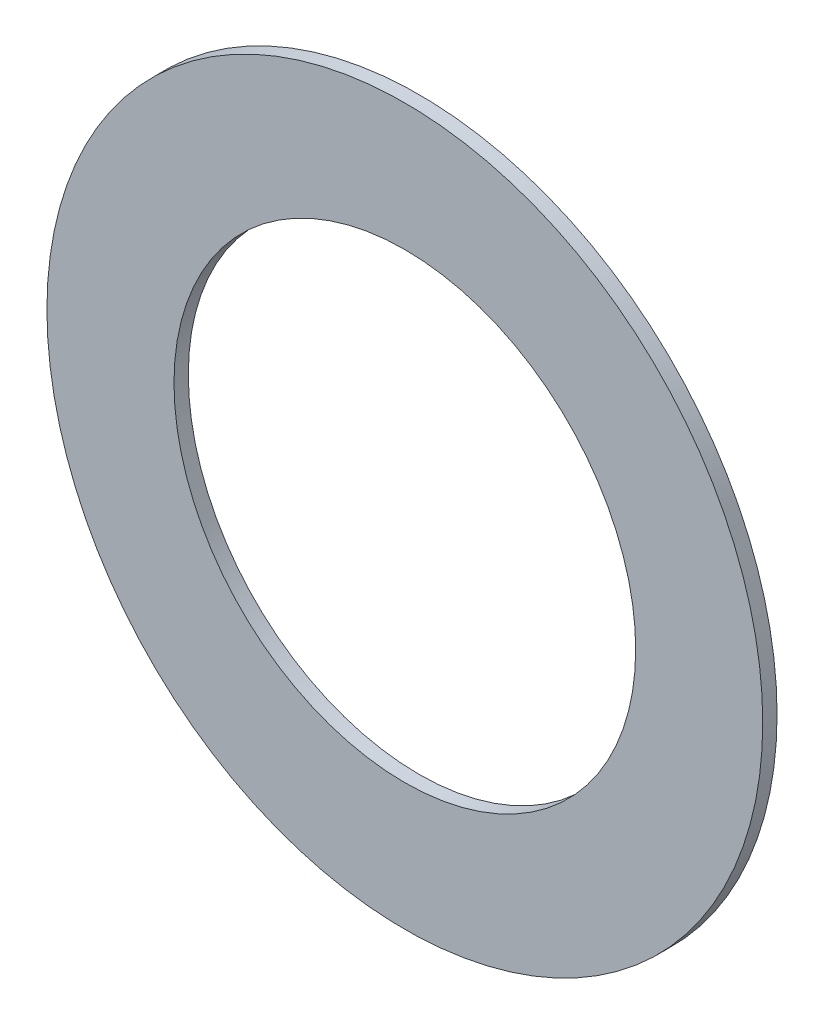
ISO-10303-21;
HEADER;
FILE_DESCRIPTION(('STEP AP214'),'2;1');
FILE_NAME('part.step','',(''),(''),'','','');
FILE_SCHEMA(('AUTOMOTIVE_DESIGN { 1 0 10303 214 1 1 1 1 }'));
ENDSEC;
DATA;
#1=APPLICATION_CONTEXT('core data for automotive mechanical design processes');
#2=APPLICATION_PROTOCOL_DEFINITION('international standard','automotive_design',2000,#1);
#3=PRODUCT_CONTEXT('',#1,'mechanical');
#4=PRODUCT('Part','Part','',(#3));
#5=PRODUCT_RELATED_PRODUCT_CATEGORY('part','',(#4));
#6=PRODUCT_DEFINITION_FORMATION('','',#4);
#7=PRODUCT_DEFINITION_CONTEXT('part definition',#1,'design');
#8=PRODUCT_DEFINITION('design','',#6,#7);
#9=PRODUCT_DEFINITION_SHAPE('','',#8);
#10=(LENGTH_UNIT() NAMED_UNIT(*) SI_UNIT(.MILLI.,.METRE.));
#11=(NAMED_UNIT(*) PLANE_ANGLE_UNIT() SI_UNIT($,.RADIAN.));
#12=(NAMED_UNIT(*) SI_UNIT($,.STERADIAN.) SOLID_ANGLE_UNIT());
#13=UNCERTAINTY_MEASURE_WITH_UNIT(LENGTH_MEASURE(1.E-05),#10,'distance_accuracy_value','');
#14=(GEOMETRIC_REPRESENTATION_CONTEXT(3) GLOBAL_UNCERTAINTY_ASSIGNED_CONTEXT((#13)) GLOBAL_UNIT_ASSIGNED_CONTEXT((#10,
#11,#12)) REPRESENTATION_CONTEXT('',''));
#15=CARTESIAN_POINT('',(0.,0.,0.));
#16=DIRECTION('',(0.,0.,1.));
#17=DIRECTION('',(1.,0.,0.));
#18=AXIS2_PLACEMENT_3D('',#15,#16,#17);
#19=CARTESIAN_POINT('',(0.,0.,1.27));
#20=DIRECTION('',(0.,0.,1.));
#21=DIRECTION('',(1.,0.,0.));
#22=AXIS2_PLACEMENT_3D('',#19,#20,#21);
#23=PLANE('',#22);
#24=CARTESIAN_POINT('',(0.,0.,1.27));
#25=DIRECTION('',(0.,0.,1.));
#26=DIRECTION('',(1.,0.,0.));
#27=AXIS2_PLACEMENT_3D('',#24,#25,#26);
#28=CIRCLE('',#27,31.75);
#29=CARTESIAN_POINT('',(31.75,0.,1.27));
#30=VERTEX_POINT('',#29);
#31=EDGE_CURVE('E10',#30,#30,#28,.T.);
#32=ORIENTED_EDGE('',*,*,#31,.T.);
#33=EDGE_LOOP('',(#32));
#34=FACE_BOUND('',#33,.T.);
#35=CARTESIAN_POINT('',(0.,0.,1.27));
#36=DIRECTION('',(0.,0.,1.));
#37=DIRECTION('',(1.,0.,0.));
#38=AXIS2_PLACEMENT_3D('',#35,#36,#37);
#39=CIRCLE('',#38,20.47875);
#40=CARTESIAN_POINT('',(20.47875,0.,1.27));
#41=VERTEX_POINT('',#40);
#42=EDGE_CURVE('E43',#41,#41,#39,.T.);
#43=ORIENTED_EDGE('',*,*,#42,.F.);
#44=EDGE_LOOP('',(#43));
#45=FACE_BOUND('',#44,.T.);
#46=ADVANCED_FACE('F32',(#34,#45),#23,.T.);
#47=CARTESIAN_POINT('',(0.,0.,0.));
#48=DIRECTION('',(0.,0.,1.));
#49=DIRECTION('',(1.,0.,0.));
#50=AXIS2_PLACEMENT_3D('',#47,#48,#49);
#51=PLANE('',#50);
#52=CARTESIAN_POINT('',(0.,0.,0.));
#53=DIRECTION('',(0.,0.,1.));
#54=DIRECTION('',(1.,0.,0.));
#55=AXIS2_PLACEMENT_3D('',#52,#53,#54);
#56=CIRCLE('',#55,31.75);
#57=CARTESIAN_POINT('',(31.75,0.,0.));
#58=VERTEX_POINT('',#57);
#59=EDGE_CURVE('E36',#58,#58,#56,.T.);
#60=ORIENTED_EDGE('',*,*,#59,.F.);
#61=EDGE_LOOP('',(#60));
#62=FACE_BOUND('',#61,.T.);
#63=CARTESIAN_POINT('',(0.,0.,0.));
#64=DIRECTION('',(0.,0.,1.));
#65=DIRECTION('',(1.,0.,0.));
#66=AXIS2_PLACEMENT_3D('',#63,#64,#65);
#67=CIRCLE('',#66,20.47875);
#68=CARTESIAN_POINT('',(20.47875,0.,0.));
#69=VERTEX_POINT('',#68);
#70=EDGE_CURVE('E45',#69,#69,#67,.T.);
#71=ORIENTED_EDGE('',*,*,#70,.T.);
#72=EDGE_LOOP('',(#71));
#73=FACE_BOUND('',#72,.T.);
#74=ADVANCED_FACE('F55',(#62,#73),#51,.F.);
#75=CARTESIAN_POINT('',(0.,0.,1.27));
#76=DIRECTION('',(0.,0.,-1.));
#77=DIRECTION('',(-1.,0.,0.));
#78=AXIS2_PLACEMENT_3D('',#75,#76,#77);
#79=CYLINDRICAL_SURFACE('',#78,31.75);
#80=ORIENTED_EDGE('',*,*,#31,.F.);
#81=EDGE_LOOP('',(#80));
#82=FACE_BOUND('',#81,.T.);
#83=ORIENTED_EDGE('',*,*,#59,.T.);
#84=EDGE_LOOP('',(#83));
#85=FACE_BOUND('',#84,.T.);
#86=ADVANCED_FACE('F34',(#82,#85),#79,.T.);
#87=CARTESIAN_POINT('',(0.,0.,1.27));
#88=DIRECTION('',(0.,0.,-1.));
#89=DIRECTION('',(-1.,0.,0.));
#90=AXIS2_PLACEMENT_3D('',#87,#88,#89);
#91=CYLINDRICAL_SURFACE('',#90,20.47875);
#92=ORIENTED_EDGE('',*,*,#42,.T.);
#93=EDGE_LOOP('',(#92));
#94=FACE_BOUND('',#93,.T.);
#95=ORIENTED_EDGE('',*,*,#70,.F.);
#96=EDGE_LOOP('',(#95));
#97=FACE_BOUND('',#96,.T.);
#98=ADVANCED_FACE('F51',(#94,#97),#91,.F.);
#99=CLOSED_SHELL('',(#46,#74,#86,#98));
#100=MANIFOLD_SOLID_BREP('B2',#99);
#101=ADVANCED_BREP_SHAPE_REPRESENTATION('',(#18,#100),#14);
#102=SHAPE_DEFINITION_REPRESENTATION(#9,#101);
ENDSEC;
END-ISO-10303-21;
